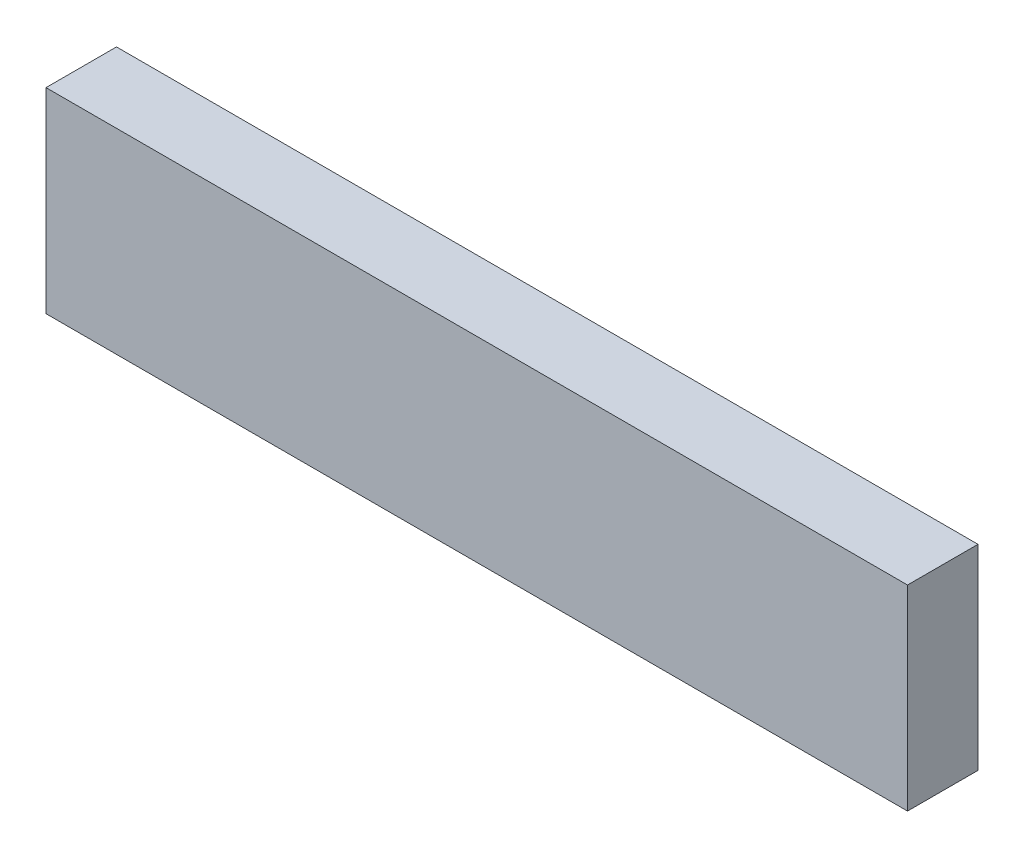
ISO-10303-21;
HEADER;
FILE_DESCRIPTION(('STEP AP214'),'2;1');
FILE_NAME('part.step','',(''),(''),'','','');
FILE_SCHEMA(('AUTOMOTIVE_DESIGN { 1 0 10303 214 1 1 1 1 }'));
ENDSEC;
DATA;
#1=APPLICATION_CONTEXT('core data for automotive mechanical design processes');
#2=APPLICATION_PROTOCOL_DEFINITION('international standard','automotive_design',2000,#1);
#3=PRODUCT_CONTEXT('',#1,'mechanical');
#4=PRODUCT('Part','Part','',(#3));
#5=PRODUCT_RELATED_PRODUCT_CATEGORY('part','',(#4));
#6=PRODUCT_DEFINITION_FORMATION('','',#4);
#7=PRODUCT_DEFINITION_CONTEXT('part definition',#1,'design');
#8=PRODUCT_DEFINITION('design','',#6,#7);
#9=PRODUCT_DEFINITION_SHAPE('','',#8);
#10=(LENGTH_UNIT() NAMED_UNIT(*) SI_UNIT(.MILLI.,.METRE.));
#11=(NAMED_UNIT(*) PLANE_ANGLE_UNIT() SI_UNIT($,.RADIAN.));
#12=(NAMED_UNIT(*) SI_UNIT($,.STERADIAN.) SOLID_ANGLE_UNIT());
#13=UNCERTAINTY_MEASURE_WITH_UNIT(LENGTH_MEASURE(1.E-05),#10,'distance_accuracy_value','');
#14=(GEOMETRIC_REPRESENTATION_CONTEXT(3) GLOBAL_UNCERTAINTY_ASSIGNED_CONTEXT((#13)) GLOBAL_UNIT_ASSIGNED_CONTEXT((#10,
#11,#12)) REPRESENTATION_CONTEXT('',''));
#15=CARTESIAN_POINT('',(0.,0.,0.));
#16=DIRECTION('',(0.,0.,1.));
#17=DIRECTION('',(1.,0.,0.));
#18=AXIS2_PLACEMENT_3D('',#15,#16,#17);
#19=CARTESIAN_POINT('',(110.,-25.,18.));
#20=DIRECTION('',(-1.,0.,0.));
#21=DIRECTION('',(0.,0.,1.));
#22=AXIS2_PLACEMENT_3D('',#19,#20,#21);
#23=PLANE('',#22);
#24=DIRECTION('',(0.,1.,0.));
#25=VECTOR('',#24,1.);
#26=CARTESIAN_POINT('',(110.,-25.,0.));
#27=LINE('',#26,#25);
#28=CARTESIAN_POINT('',(110.,-25.,0.));
#29=VERTEX_POINT('',#28);
#30=CARTESIAN_POINT('',(110.,25.,0.));
#31=VERTEX_POINT('',#30);
#32=EDGE_CURVE('E96',#29,#31,#27,.T.);
#33=ORIENTED_EDGE('',*,*,#32,.T.);
#34=DIRECTION('',(0.,0.,-1.));
#35=VECTOR('',#34,1.);
#36=CARTESIAN_POINT('',(110.,25.,18.));
#37=LINE('',#36,#35);
#38=CARTESIAN_POINT('',(110.,25.,18.));
#39=VERTEX_POINT('',#38);
#40=EDGE_CURVE('E11',#39,#31,#37,.T.);
#41=ORIENTED_EDGE('',*,*,#40,.F.);
#42=DIRECTION('',(0.,1.,0.));
#43=VECTOR('',#42,1.);
#44=CARTESIAN_POINT('',(110.,-25.,18.));
#45=LINE('',#44,#43);
#46=CARTESIAN_POINT('',(110.,-25.,18.));
#47=VERTEX_POINT('',#46);
#48=EDGE_CURVE('E84',#47,#39,#45,.T.);
#49=ORIENTED_EDGE('',*,*,#48,.F.);
#50=DIRECTION('',(0.,0.,-1.));
#51=VECTOR('',#50,1.);
#52=CARTESIAN_POINT('',(110.,-25.,18.));
#53=LINE('',#52,#51);
#54=EDGE_CURVE('E92',#47,#29,#53,.T.);
#55=ORIENTED_EDGE('',*,*,#54,.T.);
#56=EDGE_LOOP('',(#33,#41,#49,#55));
#57=FACE_BOUND('',#56,.T.);
#58=ADVANCED_FACE('F33',(#57),#23,.F.);
#59=CARTESIAN_POINT('',(-110.,25.,18.));
#60=DIRECTION('',(0.,-1.,0.));
#61=DIRECTION('',(0.,0.,-1.));
#62=AXIS2_PLACEMENT_3D('',#59,#60,#61);
#63=PLANE('',#62);
#64=DIRECTION('',(-1.,0.,0.));
#65=VECTOR('',#64,1.);
#66=CARTESIAN_POINT('',(-110.,25.,0.));
#67=LINE('',#66,#65);
#68=CARTESIAN_POINT('',(-110.,25.,0.));
#69=VERTEX_POINT('',#68);
#70=EDGE_CURVE('E88',#31,#69,#67,.T.);
#71=ORIENTED_EDGE('',*,*,#70,.T.);
#72=DIRECTION('',(0.,0.,-1.));
#73=VECTOR('',#72,1.);
#74=CARTESIAN_POINT('',(-110.,25.,18.));
#75=LINE('',#74,#73);
#76=CARTESIAN_POINT('',(-110.,25.,18.));
#77=VERTEX_POINT('',#76);
#78=EDGE_CURVE('E41',#77,#69,#75,.T.);
#79=ORIENTED_EDGE('',*,*,#78,.F.);
#80=DIRECTION('',(-1.,0.,0.));
#81=VECTOR('',#80,1.);
#82=CARTESIAN_POINT('',(-110.,25.,18.));
#83=LINE('',#82,#81);
#84=EDGE_CURVE('E79',#39,#77,#83,.T.);
#85=ORIENTED_EDGE('',*,*,#84,.F.);
#86=ORIENTED_EDGE('',*,*,#40,.T.);
#87=EDGE_LOOP('',(#71,#79,#85,#86));
#88=FACE_BOUND('',#87,.T.);
#89=ADVANCED_FACE('F87',(#88),#63,.F.);
#90=CARTESIAN_POINT('',(-110.,-25.,18.));
#91=DIRECTION('',(1.,0.,0.));
#92=DIRECTION('',(0.,0.,-1.));
#93=AXIS2_PLACEMENT_3D('',#90,#91,#92);
#94=PLANE('',#93);
#95=DIRECTION('',(0.,-1.,0.));
#96=VECTOR('',#95,1.);
#97=CARTESIAN_POINT('',(-110.,-25.,0.));
#98=LINE('',#97,#96);
#99=CARTESIAN_POINT('',(-110.,-25.,0.));
#100=VERTEX_POINT('',#99);
#101=EDGE_CURVE('E66',#69,#100,#98,.T.);
#102=ORIENTED_EDGE('',*,*,#101,.T.);
#103=DIRECTION('',(0.,0.,-1.));
#104=VECTOR('',#103,1.);
#105=CARTESIAN_POINT('',(-110.,-25.,18.));
#106=LINE('',#105,#104);
#107=CARTESIAN_POINT('',(-110.,-25.,18.));
#108=VERTEX_POINT('',#107);
#109=EDGE_CURVE('E89',#108,#100,#106,.T.);
#110=ORIENTED_EDGE('',*,*,#109,.F.);
#111=DIRECTION('',(0.,-1.,0.));
#112=VECTOR('',#111,1.);
#113=CARTESIAN_POINT('',(-110.,-25.,18.));
#114=LINE('',#113,#112);
#115=EDGE_CURVE('E82',#77,#108,#114,.T.);
#116=ORIENTED_EDGE('',*,*,#115,.F.);
#117=ORIENTED_EDGE('',*,*,#78,.T.);
#118=EDGE_LOOP('',(#102,#110,#116,#117));
#119=FACE_BOUND('',#118,.T.);
#120=ADVANCED_FACE('F90',(#119),#94,.F.);
#121=CARTESIAN_POINT('',(-110.,-25.,18.));
#122=DIRECTION('',(0.,1.,0.));
#123=DIRECTION('',(0.,0.,1.));
#124=AXIS2_PLACEMENT_3D('',#121,#122,#123);
#125=PLANE('',#124);
#126=DIRECTION('',(1.,0.,0.));
#127=VECTOR('',#126,1.);
#128=CARTESIAN_POINT('',(-110.,-25.,0.));
#129=LINE('',#128,#127);
#130=EDGE_CURVE('E72',#100,#29,#129,.T.);
#131=ORIENTED_EDGE('',*,*,#130,.T.);
#132=ORIENTED_EDGE('',*,*,#54,.F.);
#133=DIRECTION('',(1.,0.,0.));
#134=VECTOR('',#133,1.);
#135=CARTESIAN_POINT('',(-110.,-25.,18.));
#136=LINE('',#135,#134);
#137=EDGE_CURVE('E49',#108,#47,#136,.T.);
#138=ORIENTED_EDGE('',*,*,#137,.F.);
#139=ORIENTED_EDGE('',*,*,#109,.T.);
#140=EDGE_LOOP('',(#131,#132,#138,#139));
#141=FACE_BOUND('',#140,.T.);
#142=ADVANCED_FACE('F103',(#141),#125,.F.);
#143=CARTESIAN_POINT('',(0.,0.,18.));
#144=DIRECTION('',(0.,0.,-1.));
#145=DIRECTION('',(-1.,0.,0.));
#146=AXIS2_PLACEMENT_3D('',#143,#144,#145);
#147=PLANE('',#146);
#148=ORIENTED_EDGE('',*,*,#48,.T.);
#149=ORIENTED_EDGE('',*,*,#84,.T.);
#150=ORIENTED_EDGE('',*,*,#115,.T.);
#151=ORIENTED_EDGE('',*,*,#137,.T.);
#152=EDGE_LOOP('',(#148,#149,#150,#151));
#153=FACE_BOUND('',#152,.T.);
#154=ADVANCED_FACE('F80',(#153),#147,.F.);
#155=CARTESIAN_POINT('',(0.,0.,0.));
#156=DIRECTION('',(0.,0.,-1.));
#157=DIRECTION('',(-1.,0.,0.));
#158=AXIS2_PLACEMENT_3D('',#155,#156,#157);
#159=PLANE('',#158);
#160=ORIENTED_EDGE('',*,*,#32,.F.);
#161=ORIENTED_EDGE('',*,*,#130,.F.);
#162=ORIENTED_EDGE('',*,*,#101,.F.);
#163=ORIENTED_EDGE('',*,*,#70,.F.);
#164=EDGE_LOOP('',(#160,#161,#162,#163));
#165=FACE_BOUND('',#164,.T.);
#166=ADVANCED_FACE('F106',(#165),#159,.T.);
#167=CLOSED_SHELL('',(#58,#89,#120,#142,#154,#166));
#168=MANIFOLD_SOLID_BREP('B2',#167);
#169=ADVANCED_BREP_SHAPE_REPRESENTATION('',(#18,#168),#14);
#170=SHAPE_DEFINITION_REPRESENTATION(#9,#169);
ENDSEC;
END-ISO-10303-21;
